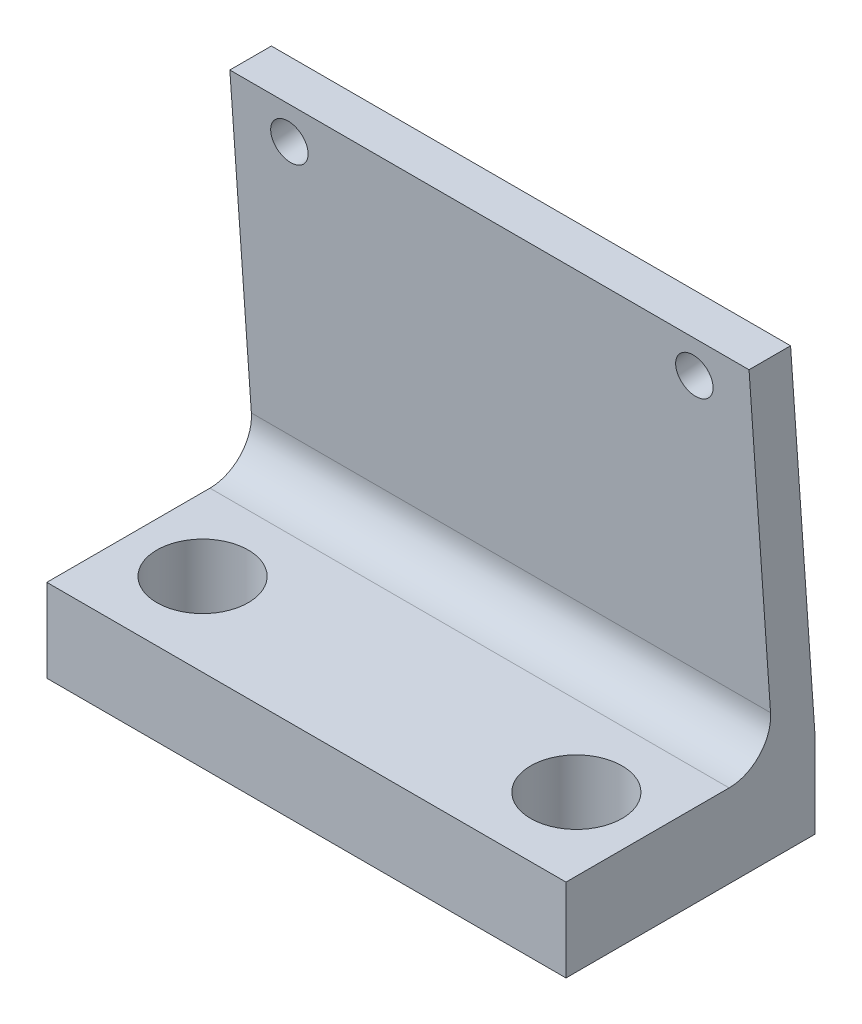
ISO-10303-21;
HEADER;
FILE_DESCRIPTION(('STEP AP214'),'2;1');
FILE_NAME('part.step','',(''),(''),'','','');
FILE_SCHEMA(('AUTOMOTIVE_DESIGN { 1 0 10303 214 1 1 1 1 }'));
ENDSEC;
DATA;
#1=APPLICATION_CONTEXT('core data for automotive mechanical design processes');
#2=APPLICATION_PROTOCOL_DEFINITION('international standard','automotive_design',2000,#1);
#3=PRODUCT_CONTEXT('',#1,'mechanical');
#4=PRODUCT('Part','Part','',(#3));
#5=PRODUCT_RELATED_PRODUCT_CATEGORY('part','',(#4));
#6=PRODUCT_DEFINITION_FORMATION('','',#4);
#7=PRODUCT_DEFINITION_CONTEXT('part definition',#1,'design');
#8=PRODUCT_DEFINITION('design','',#6,#7);
#9=PRODUCT_DEFINITION_SHAPE('','',#8);
#10=(LENGTH_UNIT() NAMED_UNIT(*) SI_UNIT(.MILLI.,.METRE.));
#11=(NAMED_UNIT(*) PLANE_ANGLE_UNIT() SI_UNIT($,.RADIAN.));
#12=(NAMED_UNIT(*) SI_UNIT($,.STERADIAN.) SOLID_ANGLE_UNIT());
#13=UNCERTAINTY_MEASURE_WITH_UNIT(LENGTH_MEASURE(1.E-05),#10,'distance_accuracy_value','');
#14=(GEOMETRIC_REPRESENTATION_CONTEXT(3) GLOBAL_UNCERTAINTY_ASSIGNED_CONTEXT((#13)) GLOBAL_UNIT_ASSIGNED_CONTEXT((#10,
#11,#12)) REPRESENTATION_CONTEXT('',''));
#15=CARTESIAN_POINT('',(0.,0.,0.));
#16=DIRECTION('',(0.,0.,1.));
#17=DIRECTION('',(1.,0.,0.));
#18=AXIS2_PLACEMENT_3D('',#15,#16,#17);
#19=CARTESIAN_POINT('',(0.,4.,0.));
#20=DIRECTION('',(0.,1.,0.));
#21=DIRECTION('',(0.,0.,1.));
#22=AXIS2_PLACEMENT_3D('',#19,#20,#21);
#23=PLANE('',#22);
#24=DIRECTION('',(0.,0.,-1.));
#25=VECTOR('',#24,1.);
#26=CARTESIAN_POINT('',(12.5,4.,-7.25806451612903));
#27=LINE('',#26,#25);
#28=CARTESIAN_POINT('',(12.5,4.,4.74193548387097));
#29=VERTEX_POINT('',#28);
#30=CARTESIAN_POINT('',(12.5,4.,-3.11332709607968));
#31=VERTEX_POINT('',#30);
#32=EDGE_CURVE('E145',#29,#31,#27,.T.);
#33=ORIENTED_EDGE('',*,*,#32,.T.);
#34=DIRECTION('',(1.,0.,0.));
#35=VECTOR('',#34,1.);
#36=CARTESIAN_POINT('',(0.,4.,-3.11332709607968));
#37=LINE('',#36,#35);
#38=CARTESIAN_POINT('',(-12.5,4.,-3.11332709607968));
#39=VERTEX_POINT('',#38);
#40=EDGE_CURVE('E54',#31,#39,#37,.F.);
#41=ORIENTED_EDGE('',*,*,#40,.T.);
#42=DIRECTION('',(0.,0.,1.));
#43=VECTOR('',#42,1.);
#44=CARTESIAN_POINT('',(-12.5,4.,-7.25806451612902));
#45=LINE('',#44,#43);
#46=CARTESIAN_POINT('',(-12.5,4.,4.74193548387098));
#47=VERTEX_POINT('',#46);
#48=EDGE_CURVE('E140',#39,#47,#45,.T.);
#49=ORIENTED_EDGE('',*,*,#48,.T.);
#50=DIRECTION('',(1.,0.,0.));
#51=VECTOR('',#50,1.);
#52=CARTESIAN_POINT('',(-12.5,4.,4.74193548387098));
#53=LINE('',#52,#51);
#54=EDGE_CURVE('E142',#47,#29,#53,.T.);
#55=ORIENTED_EDGE('',*,*,#54,.T.);
#56=EDGE_LOOP('',(#33,#41,#49,#55));
#57=FACE_BOUND('',#56,.T.);
#58=CARTESIAN_POINT('',(9.,4.,0.741935483870975));
#59=DIRECTION('',(0.,1.,0.));
#60=DIRECTION('',(0.,0.,1.));
#61=AXIS2_PLACEMENT_3D('',#58,#59,#60);
#62=CIRCLE('',#61,2.2);
#63=CARTESIAN_POINT('',(9.,4.,2.94193548387098));
#64=VERTEX_POINT('',#63);
#65=EDGE_CURVE('E134',#64,#64,#62,.T.);
#66=ORIENTED_EDGE('',*,*,#65,.F.);
#67=EDGE_LOOP('',(#66));
#68=FACE_BOUND('',#67,.T.);
#69=CARTESIAN_POINT('',(-9.,4.,0.741935483870977));
#70=DIRECTION('',(0.,1.,0.));
#71=DIRECTION('',(0.,0.,1.));
#72=AXIS2_PLACEMENT_3D('',#69,#70,#71);
#73=CIRCLE('',#72,2.2);
#74=CARTESIAN_POINT('',(-9.,4.,2.94193548387098));
#75=VERTEX_POINT('',#74);
#76=EDGE_CURVE('E125',#75,#75,#73,.T.);
#77=ORIENTED_EDGE('',*,*,#76,.F.);
#78=EDGE_LOOP('',(#77));
#79=FACE_BOUND('',#78,.T.);
#80=ADVANCED_FACE('F33',(#57,#68,#79),#23,.T.);
#81=CARTESIAN_POINT('',(0.,0.,0.));
#82=DIRECTION('',(0.,1.,0.));
#83=DIRECTION('',(0.,0.,1.));
#84=AXIS2_PLACEMENT_3D('',#81,#82,#83);
#85=PLANE('',#84);
#86=DIRECTION('',(0.,0.,1.));
#87=VECTOR('',#86,1.);
#88=CARTESIAN_POINT('',(-12.5,0.,-7.25806451612902));
#89=LINE('',#88,#87);
#90=CARTESIAN_POINT('',(-12.5,0.,-7.25806451612902));
#91=VERTEX_POINT('',#90);
#92=CARTESIAN_POINT('',(-12.5,0.,4.74193548387098));
#93=VERTEX_POINT('',#92);
#94=EDGE_CURVE('E137',#91,#93,#89,.T.);
#95=ORIENTED_EDGE('',*,*,#94,.F.);
#96=DIRECTION('',(-1.,0.,0.));
#97=VECTOR('',#96,1.);
#98=CARTESIAN_POINT('',(-12.5,0.,-7.25806451612902));
#99=LINE('',#98,#97);
#100=CARTESIAN_POINT('',(12.5,0.,-7.25806451612903));
#101=VERTEX_POINT('',#100);
#102=EDGE_CURVE('E143',#101,#91,#99,.T.);
#103=ORIENTED_EDGE('',*,*,#102,.F.);
#104=DIRECTION('',(0.,0.,-1.));
#105=VECTOR('',#104,1.);
#106=CARTESIAN_POINT('',(12.5,0.,-7.25806451612903));
#107=LINE('',#106,#105);
#108=CARTESIAN_POINT('',(12.5,0.,4.74193548387097));
#109=VERTEX_POINT('',#108);
#110=EDGE_CURVE('E154',#109,#101,#107,.T.);
#111=ORIENTED_EDGE('',*,*,#110,.F.);
#112=DIRECTION('',(1.,0.,0.));
#113=VECTOR('',#112,1.);
#114=CARTESIAN_POINT('',(-12.5,0.,4.74193548387098));
#115=LINE('',#114,#113);
#116=EDGE_CURVE('E152',#93,#109,#115,.T.);
#117=ORIENTED_EDGE('',*,*,#116,.F.);
#118=EDGE_LOOP('',(#95,#103,#111,#117));
#119=FACE_BOUND('',#118,.T.);
#120=CARTESIAN_POINT('',(9.,0.,0.741935483870975));
#121=DIRECTION('',(0.,1.,0.));
#122=DIRECTION('',(0.,0.,1.));
#123=AXIS2_PLACEMENT_3D('',#120,#121,#122);
#124=CIRCLE('',#123,2.2);
#125=CARTESIAN_POINT('',(9.,0.,2.94193548387098));
#126=VERTEX_POINT('',#125);
#127=EDGE_CURVE('E132',#126,#126,#124,.T.);
#128=ORIENTED_EDGE('',*,*,#127,.T.);
#129=EDGE_LOOP('',(#128));
#130=FACE_BOUND('',#129,.T.);
#131=CARTESIAN_POINT('',(-9.,0.,0.741935483870977));
#132=DIRECTION('',(0.,1.,0.));
#133=DIRECTION('',(0.,0.,1.));
#134=AXIS2_PLACEMENT_3D('',#131,#132,#133);
#135=CIRCLE('',#134,2.2);
#136=CARTESIAN_POINT('',(-9.,0.,2.94193548387098));
#137=VERTEX_POINT('',#136);
#138=EDGE_CURVE('E122',#137,#137,#135,.T.);
#139=ORIENTED_EDGE('',*,*,#138,.T.);
#140=EDGE_LOOP('',(#139));
#141=FACE_BOUND('',#140,.T.);
#142=ADVANCED_FACE('F192',(#119,#130,#141),#85,.F.);
#143=CARTESIAN_POINT('',(-12.5,4.,-7.25806451612902));
#144=DIRECTION('',(1.,0.,0.));
#145=DIRECTION('',(0.,0.,-1.));
#146=AXIS2_PLACEMENT_3D('',#143,#144,#145);
#147=PLANE('',#146);
#148=ORIENTED_EDGE('',*,*,#94,.T.);
#149=DIRECTION('',(0.,-1.,0.));
#150=VECTOR('',#149,1.);
#151=CARTESIAN_POINT('',(-12.5,4.,4.74193548387098));
#152=LINE('',#151,#150);
#153=EDGE_CURVE('E165',#47,#93,#152,.T.);
#154=ORIENTED_EDGE('',*,*,#153,.F.);
#155=ORIENTED_EDGE('',*,*,#48,.F.);
#156=CARTESIAN_POINT('',(-12.5,6.,-3.11332709607968));
#157=DIRECTION('',(1.,0.,0.));
#158=DIRECTION('',(0.,0.,-1.));
#159=AXIS2_PLACEMENT_3D('',#156,#157,#158);
#160=CIRCLE('',#159,2.);
#161=CARTESIAN_POINT('',(-12.5,6.13951294748823,-5.10845519659932));
#162=VERTEX_POINT('',#161);
#163=EDGE_CURVE('E11',#39,#162,#160,.T.);
#164=ORIENTED_EDGE('',*,*,#163,.T.);
#165=DIRECTION('',(0.,-0.997564050259825,-0.0697564737441182));
#166=VECTOR('',#165,1.);
#167=CARTESIAN_POINT('',(-12.5,20.958588854417,-4.07220446247902));
#168=LINE('',#167,#166);
#169=CARTESIAN_POINT('',(-12.5,20.958588854417,-4.07220446247902));
#170=VERTEX_POINT('',#169);
#171=EDGE_CURVE('E102',#170,#162,#168,.T.);
#172=ORIENTED_EDGE('',*,*,#171,.F.);
#173=DIRECTION('',(0.,0.,1.));
#174=VECTOR('',#173,1.);
#175=CARTESIAN_POINT('',(-12.5,20.958588854417,-6.07220446247902));
#176=LINE('',#175,#174);
#177=CARTESIAN_POINT('',(-12.5,20.958588854417,-6.07220446247902));
#178=VERTEX_POINT('',#177);
#179=EDGE_CURVE('E108',#178,#170,#176,.T.);
#180=ORIENTED_EDGE('',*,*,#179,.F.);
#181=DIRECTION('',(0.,-0.997564050259825,-0.0697564737441182));
#182=VECTOR('',#181,1.);
#183=CARTESIAN_POINT('',(-12.5,20.958588854417,-6.07220446247902));
#184=LINE('',#183,#182);
#185=CARTESIAN_POINT('',(-12.5,4.,-7.25806451612902));
#186=VERTEX_POINT('',#185);
#187=EDGE_CURVE('E181',#178,#186,#184,.T.);
#188=ORIENTED_EDGE('',*,*,#187,.T.);
#189=DIRECTION('',(0.,-1.,0.));
#190=VECTOR('',#189,1.);
#191=CARTESIAN_POINT('',(-12.5,4.,-7.25806451612902));
#192=LINE('',#191,#190);
#193=EDGE_CURVE('E150',#186,#91,#192,.T.);
#194=ORIENTED_EDGE('',*,*,#193,.T.);
#195=EDGE_LOOP('',(#148,#154,#155,#164,#172,#180,#188,#194));
#196=FACE_BOUND('',#195,.T.);
#197=ADVANCED_FACE('F120',(#196),#147,.F.);
#198=CARTESIAN_POINT('',(-12.5,4.,4.74193548387098));
#199=DIRECTION('',(0.,0.,-1.));
#200=DIRECTION('',(-1.,0.,0.));
#201=AXIS2_PLACEMENT_3D('',#198,#199,#200);
#202=PLANE('',#201);
#203=ORIENTED_EDGE('',*,*,#116,.T.);
#204=DIRECTION('',(0.,-1.,0.));
#205=VECTOR('',#204,1.);
#206=CARTESIAN_POINT('',(12.5,4.,4.74193548387097));
#207=LINE('',#206,#205);
#208=EDGE_CURVE('E162',#29,#109,#207,.T.);
#209=ORIENTED_EDGE('',*,*,#208,.F.);
#210=ORIENTED_EDGE('',*,*,#54,.F.);
#211=ORIENTED_EDGE('',*,*,#153,.T.);
#212=EDGE_LOOP('',(#203,#209,#210,#211));
#213=FACE_BOUND('',#212,.T.);
#214=ADVANCED_FACE('F198',(#213),#202,.F.);
#215=CARTESIAN_POINT('',(12.5,4.,-7.25806451612903));
#216=DIRECTION('',(-1.,0.,0.));
#217=DIRECTION('',(0.,0.,1.));
#218=AXIS2_PLACEMENT_3D('',#215,#216,#217);
#219=PLANE('',#218);
#220=ORIENTED_EDGE('',*,*,#110,.T.);
#221=DIRECTION('',(0.,-1.,0.));
#222=VECTOR('',#221,1.);
#223=CARTESIAN_POINT('',(12.5,4.,-7.25806451612903));
#224=LINE('',#223,#222);
#225=CARTESIAN_POINT('',(12.5,4.,-7.25806451612903));
#226=VERTEX_POINT('',#225);
#227=EDGE_CURVE('E159',#226,#101,#224,.T.);
#228=ORIENTED_EDGE('',*,*,#227,.F.);
#229=DIRECTION('',(0.,-0.997564050259825,-0.0697564737441182));
#230=VECTOR('',#229,1.);
#231=CARTESIAN_POINT('',(12.5,20.958588854417,-6.07220446247902));
#232=LINE('',#231,#230);
#233=CARTESIAN_POINT('',(12.5,20.958588854417,-6.07220446247902));
#234=VERTEX_POINT('',#233);
#235=EDGE_CURVE('E127',#234,#226,#232,.T.);
#236=ORIENTED_EDGE('',*,*,#235,.F.);
#237=DIRECTION('',(0.,0.,-1.));
#238=VECTOR('',#237,1.);
#239=CARTESIAN_POINT('',(12.5,20.958588854417,-6.07220446247902));
#240=LINE('',#239,#238);
#241=CARTESIAN_POINT('',(12.5,20.958588854417,-4.07220446247902));
#242=VERTEX_POINT('',#241);
#243=EDGE_CURVE('E107',#242,#234,#240,.T.);
#244=ORIENTED_EDGE('',*,*,#243,.F.);
#245=DIRECTION('',(0.,-0.997564050259825,-0.0697564737441182));
#246=VECTOR('',#245,1.);
#247=CARTESIAN_POINT('',(12.5,20.958588854417,-4.07220446247902));
#248=LINE('',#247,#246);
#249=CARTESIAN_POINT('',(12.5,6.13951294748823,-5.10845519659932));
#250=VERTEX_POINT('',#249);
#251=EDGE_CURVE('E104',#242,#250,#248,.T.);
#252=ORIENTED_EDGE('',*,*,#251,.T.);
#253=CARTESIAN_POINT('',(12.5,6.,-3.11332709607968));
#254=DIRECTION('',(-1.,0.,0.));
#255=DIRECTION('',(0.,0.,1.));
#256=AXIS2_PLACEMENT_3D('',#253,#254,#255);
#257=CIRCLE('',#256,2.);
#258=EDGE_CURVE('E41',#250,#31,#257,.T.);
#259=ORIENTED_EDGE('',*,*,#258,.T.);
#260=ORIENTED_EDGE('',*,*,#32,.F.);
#261=ORIENTED_EDGE('',*,*,#208,.T.);
#262=EDGE_LOOP('',(#220,#228,#236,#244,#252,#259,#260,#261));
#263=FACE_BOUND('',#262,.T.);
#264=ADVANCED_FACE('F177',(#263),#219,.F.);
#265=CARTESIAN_POINT('',(-12.5,4.,-7.25806451612902));
#266=DIRECTION('',(0.,0.,1.));
#267=DIRECTION('',(1.,0.,0.));
#268=AXIS2_PLACEMENT_3D('',#265,#266,#267);
#269=PLANE('',#268);
#270=ORIENTED_EDGE('',*,*,#102,.T.);
#271=ORIENTED_EDGE('',*,*,#193,.F.);
#272=DIRECTION('',(-1.,0.,0.));
#273=VECTOR('',#272,1.);
#274=CARTESIAN_POINT('',(-12.5,4.,-7.25806451612902));
#275=LINE('',#274,#273);
#276=EDGE_CURVE('E147',#226,#186,#275,.T.);
#277=ORIENTED_EDGE('',*,*,#276,.F.);
#278=ORIENTED_EDGE('',*,*,#227,.T.);
#279=EDGE_LOOP('',(#270,#271,#277,#278));
#280=FACE_BOUND('',#279,.T.);
#281=ADVANCED_FACE('F218',(#280),#269,.F.);
#282=CARTESIAN_POINT('',(9.,4.,0.741935483870975));
#283=DIRECTION('',(0.,-1.,0.));
#284=DIRECTION('',(0.,0.,-1.));
#285=AXIS2_PLACEMENT_3D('',#282,#283,#284);
#286=CYLINDRICAL_SURFACE('',#285,2.2);
#287=ORIENTED_EDGE('',*,*,#65,.T.);
#288=EDGE_LOOP('',(#287));
#289=FACE_BOUND('',#288,.T.);
#290=ORIENTED_EDGE('',*,*,#127,.F.);
#291=EDGE_LOOP('',(#290));
#292=FACE_BOUND('',#291,.T.);
#293=ADVANCED_FACE('F215',(#289,#292),#286,.F.);
#294=CARTESIAN_POINT('',(-9.,4.,0.741935483870977));
#295=DIRECTION('',(0.,-1.,0.));
#296=DIRECTION('',(0.,0.,-1.));
#297=AXIS2_PLACEMENT_3D('',#294,#295,#296);
#298=CYLINDRICAL_SURFACE('',#297,2.2);
#299=ORIENTED_EDGE('',*,*,#76,.T.);
#300=EDGE_LOOP('',(#299));
#301=FACE_BOUND('',#300,.T.);
#302=ORIENTED_EDGE('',*,*,#138,.F.);
#303=EDGE_LOOP('',(#302));
#304=FACE_BOUND('',#303,.T.);
#305=ADVANCED_FACE('F250',(#301,#304),#298,.F.);
#306=CARTESIAN_POINT('',(-12.5,20.958588854417,-4.07220446247902));
#307=DIRECTION('',(0.,0.0697564737441182,-0.997564050259825));
#308=DIRECTION('',(0.,0.997564050259825,0.0697564737441182));
#309=AXIS2_PLACEMENT_3D('',#306,#307,#308);
#310=PLANE('',#309);
#311=CARTESIAN_POINT('',(-9.75,19.2795653830121,-4.18961322101268));
#312=DIRECTION('',(0.,-0.0697564737441182,0.997564050259825));
#313=DIRECTION('',(0.,-0.997564050259825,-0.0697564737441182));
#314=AXIS2_PLACEMENT_3D('',#311,#312,#313);
#315=CIRCLE('',#314,0.900000000000004);
#316=CARTESIAN_POINT('',(-9.75,18.3817577377783,-4.25239404738238));
#317=VERTEX_POINT('',#316);
#318=EDGE_CURVE('E172',#317,#317,#315,.T.);
#319=ORIENTED_EDGE('',*,*,#318,.F.);
#320=EDGE_LOOP('',(#319));
#321=FACE_BOUND('',#320,.T.);
#322=CARTESIAN_POINT('',(9.75,19.2795653830121,-4.18961322101268));
#323=DIRECTION('',(0.,-0.0697564737441182,0.997564050259825));
#324=DIRECTION('',(0.,-0.997564050259825,-0.0697564737441182));
#325=AXIS2_PLACEMENT_3D('',#322,#323,#324);
#326=CIRCLE('',#325,0.900000000000004);
#327=CARTESIAN_POINT('',(9.75,18.3817577377783,-4.25239404738238));
#328=VERTEX_POINT('',#327);
#329=EDGE_CURVE('E330',#328,#328,#326,.T.);
#330=ORIENTED_EDGE('',*,*,#329,.F.);
#331=EDGE_LOOP('',(#330));
#332=FACE_BOUND('',#331,.T.);
#333=ORIENTED_EDGE('',*,*,#171,.T.);
#334=DIRECTION('',(1.,0.,0.));
#335=VECTOR('',#334,1.);
#336=CARTESIAN_POINT('',(-12.5,6.13951294748824,-5.10845519659932));
#337=LINE('',#336,#335);
#338=EDGE_CURVE('E168',#162,#250,#337,.T.);
#339=ORIENTED_EDGE('',*,*,#338,.T.);
#340=ORIENTED_EDGE('',*,*,#251,.F.);
#341=DIRECTION('',(1.,0.,0.));
#342=VECTOR('',#341,1.);
#343=CARTESIAN_POINT('',(-12.5,20.958588854417,-4.07220446247902));
#344=LINE('',#343,#342);
#345=EDGE_CURVE('E97',#170,#242,#344,.T.);
#346=ORIENTED_EDGE('',*,*,#345,.F.);
#347=EDGE_LOOP('',(#333,#339,#340,#346));
#348=FACE_BOUND('',#347,.T.);
#349=ADVANCED_FACE('F99',(#321,#332,#348),#310,.F.);
#350=CARTESIAN_POINT('',(-12.5,20.958588854417,-6.07220446247902));
#351=DIRECTION('',(0.,-0.0697564737441182,0.997564050259825));
#352=DIRECTION('',(0.,-0.997564050259825,-0.0697564737441182));
#353=AXIS2_PLACEMENT_3D('',#350,#351,#352);
#354=PLANE('',#353);
#355=CARTESIAN_POINT('',(-9.75,19.4187384839722,-6.17988128975425));
#356=DIRECTION('',(0.,-0.0697564737441182,0.997564050259825));
#357=DIRECTION('',(0.,-0.997564050259825,-0.0697564737441182));
#358=AXIS2_PLACEMENT_3D('',#355,#356,#357);
#359=CIRCLE('',#358,0.900000000000004);
#360=CARTESIAN_POINT('',(-9.75,18.5209308387383,-6.24266211612395));
#361=VERTEX_POINT('',#360);
#362=EDGE_CURVE('E117',#361,#361,#359,.T.);
#363=ORIENTED_EDGE('',*,*,#362,.T.);
#364=EDGE_LOOP('',(#363));
#365=FACE_BOUND('',#364,.T.);
#366=CARTESIAN_POINT('',(9.75,19.4187384839722,-6.17988128975425));
#367=DIRECTION('',(0.,-0.0697564737441182,0.997564050259825));
#368=DIRECTION('',(0.,-0.997564050259825,-0.0697564737441182));
#369=AXIS2_PLACEMENT_3D('',#366,#367,#368);
#370=CIRCLE('',#369,0.900000000000004);
#371=CARTESIAN_POINT('',(9.75,18.5209308387383,-6.24266211612395));
#372=VERTEX_POINT('',#371);
#373=EDGE_CURVE('E169',#372,#372,#370,.T.);
#374=ORIENTED_EDGE('',*,*,#373,.T.);
#375=EDGE_LOOP('',(#374));
#376=FACE_BOUND('',#375,.T.);
#377=ORIENTED_EDGE('',*,*,#276,.T.);
#378=ORIENTED_EDGE('',*,*,#187,.F.);
#379=DIRECTION('',(-1.,0.,0.));
#380=VECTOR('',#379,1.);
#381=CARTESIAN_POINT('',(-12.5,20.958588854417,-6.07220446247902));
#382=LINE('',#381,#380);
#383=EDGE_CURVE('E113',#234,#178,#382,.T.);
#384=ORIENTED_EDGE('',*,*,#383,.F.);
#385=ORIENTED_EDGE('',*,*,#235,.T.);
#386=EDGE_LOOP('',(#377,#378,#384,#385));
#387=FACE_BOUND('',#386,.T.);
#388=ADVANCED_FACE('F185',(#365,#376,#387),#354,.F.);
#389=CARTESIAN_POINT('',(0.,20.958588854417,1.18586005365001));
#390=DIRECTION('',(0.,1.,0.));
#391=DIRECTION('',(0.,0.,1.));
#392=AXIS2_PLACEMENT_3D('',#389,#390,#391);
#393=PLANE('',#392);
#394=ORIENTED_EDGE('',*,*,#179,.T.);
#395=ORIENTED_EDGE('',*,*,#345,.T.);
#396=ORIENTED_EDGE('',*,*,#243,.T.);
#397=ORIENTED_EDGE('',*,*,#383,.T.);
#398=EDGE_LOOP('',(#394,#395,#396,#397));
#399=FACE_BOUND('',#398,.T.);
#400=ADVANCED_FACE('F111',(#399),#393,.T.);
#401=CARTESIAN_POINT('',(9.75,20.4654254366621,-21.1482020754297));
#402=DIRECTION('',(0.,-0.0697564737441182,0.997564050259825));
#403=DIRECTION('',(0.,-0.997564050259825,-0.0697564737441182));
#404=AXIS2_PLACEMENT_3D('',#401,#402,#403);
#405=CYLINDRICAL_SURFACE('',#404,0.900000000000004);
#406=ORIENTED_EDGE('',*,*,#329,.T.);
#407=EDGE_LOOP('',(#406));
#408=FACE_BOUND('',#407,.T.);
#409=ORIENTED_EDGE('',*,*,#373,.F.);
#410=EDGE_LOOP('',(#409));
#411=FACE_BOUND('',#410,.T.);
#412=ADVANCED_FACE('F204',(#408,#411),#405,.F.);
#413=CARTESIAN_POINT('',(-9.75,20.4654254366621,-21.1482020754297));
#414=DIRECTION('',(0.,-0.0697564737441182,0.997564050259825));
#415=DIRECTION('',(0.,-0.997564050259825,-0.0697564737441182));
#416=AXIS2_PLACEMENT_3D('',#413,#414,#415);
#417=CYLINDRICAL_SURFACE('',#416,0.900000000000004);
#418=ORIENTED_EDGE('',*,*,#318,.T.);
#419=EDGE_LOOP('',(#418));
#420=FACE_BOUND('',#419,.T.);
#421=ORIENTED_EDGE('',*,*,#362,.F.);
#422=EDGE_LOOP('',(#421));
#423=FACE_BOUND('',#422,.T.);
#424=ADVANCED_FACE('F200',(#420,#423),#417,.F.);
#425=CARTESIAN_POINT('',(-12.5,6.,-3.11332709607968));
#426=DIRECTION('',(1.,0.,0.));
#427=DIRECTION('',(0.,0.,-1.));
#428=AXIS2_PLACEMENT_3D('',#425,#426,#427);
#429=CYLINDRICAL_SURFACE('',#428,2.);
#430=ORIENTED_EDGE('',*,*,#163,.F.);
#431=ORIENTED_EDGE('',*,*,#40,.F.);
#432=ORIENTED_EDGE('',*,*,#258,.F.);
#433=ORIENTED_EDGE('',*,*,#338,.F.);
#434=EDGE_LOOP('',(#430,#431,#432,#433));
#435=FACE_BOUND('',#434,.T.);
#436=ADVANCED_FACE('F35',(#435),#429,.F.);
#437=CLOSED_SHELL('',(#80,#142,#197,#214,#264,#281,#293,#305,#349,#388,#400,#412,#424,#436));
#438=MANIFOLD_SOLID_BREP('B2',#437);
#439=ADVANCED_BREP_SHAPE_REPRESENTATION('',(#18,#438),#14);
#440=SHAPE_DEFINITION_REPRESENTATION(#9,#439);
ENDSEC;
END-ISO-10303-21;
